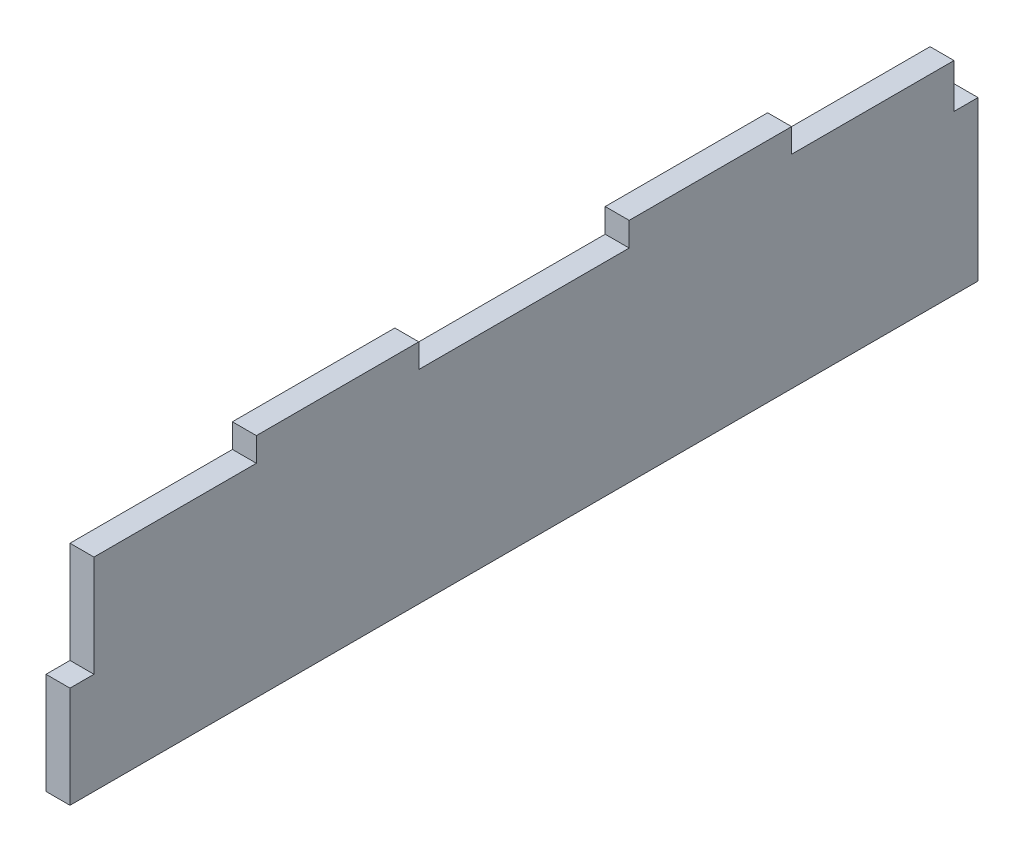
ISO-10303-21;
HEADER;
FILE_DESCRIPTION(('STEP AP214'),'2;1');
FILE_NAME('part.step','',(''),(''),'','','');
FILE_SCHEMA(('AUTOMOTIVE_DESIGN { 1 0 10303 214 1 1 1 1 }'));
ENDSEC;
DATA;
#1=APPLICATION_CONTEXT('core data for automotive mechanical design processes');
#2=APPLICATION_PROTOCOL_DEFINITION('international standard','automotive_design',2000,#1);
#3=PRODUCT_CONTEXT('',#1,'mechanical');
#4=PRODUCT('Part','Part','',(#3));
#5=PRODUCT_RELATED_PRODUCT_CATEGORY('part','',(#4));
#6=PRODUCT_DEFINITION_FORMATION('','',#4);
#7=PRODUCT_DEFINITION_CONTEXT('part definition',#1,'design');
#8=PRODUCT_DEFINITION('design','',#6,#7);
#9=PRODUCT_DEFINITION_SHAPE('','',#8);
#10=(LENGTH_UNIT() NAMED_UNIT(*) SI_UNIT(.MILLI.,.METRE.));
#11=(NAMED_UNIT(*) PLANE_ANGLE_UNIT() SI_UNIT($,.RADIAN.));
#12=(NAMED_UNIT(*) SI_UNIT($,.STERADIAN.) SOLID_ANGLE_UNIT());
#13=UNCERTAINTY_MEASURE_WITH_UNIT(LENGTH_MEASURE(1.E-05),#10,'distance_accuracy_value','');
#14=(GEOMETRIC_REPRESENTATION_CONTEXT(3) GLOBAL_UNCERTAINTY_ASSIGNED_CONTEXT((#13)) GLOBAL_UNIT_ASSIGNED_CONTEXT((#10,
#11,#12)) REPRESENTATION_CONTEXT('',''));
#15=CARTESIAN_POINT('',(0.,0.,0.));
#16=DIRECTION('',(0.,0.,1.));
#17=DIRECTION('',(1.,0.,0.));
#18=AXIS2_PLACEMENT_3D('',#15,#16,#17);
#19=CARTESIAN_POINT('',(3.,0.,-113.6));
#20=DIRECTION('',(0.,1.,0.));
#21=DIRECTION('',(0.,0.,1.));
#22=AXIS2_PLACEMENT_3D('',#19,#20,#21);
#23=PLANE('',#22);
#24=DIRECTION('',(0.,0.,-1.));
#25=VECTOR('',#24,1.);
#26=CARTESIAN_POINT('',(0.,0.,-113.6));
#27=LINE('',#26,#25);
#28=CARTESIAN_POINT('',(0.,0.,0.));
#29=VERTEX_POINT('',#28);
#30=CARTESIAN_POINT('',(0.,0.,-113.6));
#31=VERTEX_POINT('',#30);
#32=EDGE_CURVE('E177',#29,#31,#27,.T.);
#33=ORIENTED_EDGE('',*,*,#32,.T.);
#34=DIRECTION('',(-1.,0.,0.));
#35=VECTOR('',#34,1.);
#36=CARTESIAN_POINT('',(3.,0.,-113.6));
#37=LINE('',#36,#35);
#38=CARTESIAN_POINT('',(3.,0.,-113.6));
#39=VERTEX_POINT('',#38);
#40=EDGE_CURVE('E11',#39,#31,#37,.T.);
#41=ORIENTED_EDGE('',*,*,#40,.F.);
#42=DIRECTION('',(0.,0.,-1.));
#43=VECTOR('',#42,1.);
#44=CARTESIAN_POINT('',(3.,0.,-113.6));
#45=LINE('',#44,#43);
#46=CARTESIAN_POINT('',(3.,0.,0.));
#47=VERTEX_POINT('',#46);
#48=EDGE_CURVE('E207',#47,#39,#45,.T.);
#49=ORIENTED_EDGE('',*,*,#48,.F.);
#50=DIRECTION('',(-1.,0.,0.));
#51=VECTOR('',#50,1.);
#52=CARTESIAN_POINT('',(3.,0.,0.));
#53=LINE('',#52,#51);
#54=EDGE_CURVE('E173',#47,#29,#53,.T.);
#55=ORIENTED_EDGE('',*,*,#54,.T.);
#56=EDGE_LOOP('',(#33,#41,#49,#55));
#57=FACE_BOUND('',#56,.T.);
#58=ADVANCED_FACE('F33',(#57),#23,.F.);
#59=CARTESIAN_POINT('',(3.,19.8867256637168,-113.6));
#60=DIRECTION('',(0.,0.,1.));
#61=DIRECTION('',(1.,0.,0.));
#62=AXIS2_PLACEMENT_3D('',#59,#60,#61);
#63=PLANE('',#62);
#64=DIRECTION('',(0.,1.,0.));
#65=VECTOR('',#64,1.);
#66=CARTESIAN_POINT('',(0.,19.8867256637168,-113.6));
#67=LINE('',#66,#65);
#68=CARTESIAN_POINT('',(0.,19.8867256637168,-113.6));
#69=VERTEX_POINT('',#68);
#70=EDGE_CURVE('E180',#31,#69,#67,.T.);
#71=ORIENTED_EDGE('',*,*,#70,.T.);
#72=DIRECTION('',(-1.,0.,0.));
#73=VECTOR('',#72,1.);
#74=CARTESIAN_POINT('',(3.,19.8867256637168,-113.6));
#75=LINE('',#74,#73);
#76=CARTESIAN_POINT('',(3.,19.8867256637168,-113.6));
#77=VERTEX_POINT('',#76);
#78=EDGE_CURVE('E41',#77,#69,#75,.T.);
#79=ORIENTED_EDGE('',*,*,#78,.F.);
#80=DIRECTION('',(0.,1.,0.));
#81=VECTOR('',#80,1.);
#82=CARTESIAN_POINT('',(3.,19.8867256637168,-113.6));
#83=LINE('',#82,#81);
#84=EDGE_CURVE('E116',#39,#77,#83,.T.);
#85=ORIENTED_EDGE('',*,*,#84,.F.);
#86=ORIENTED_EDGE('',*,*,#40,.T.);
#87=EDGE_LOOP('',(#71,#79,#85,#86));
#88=FACE_BOUND('',#87,.T.);
#89=ADVANCED_FACE('F305',(#88),#63,.F.);
#90=CARTESIAN_POINT('',(3.,19.8867256637168,-110.6));
#91=DIRECTION('',(0.,-1.,0.));
#92=DIRECTION('',(0.,0.,-1.));
#93=AXIS2_PLACEMENT_3D('',#90,#91,#92);
#94=PLANE('',#93);
#95=DIRECTION('',(0.,0.,1.));
#96=VECTOR('',#95,1.);
#97=CARTESIAN_POINT('',(0.,19.8867256637168,-110.6));
#98=LINE('',#97,#96);
#99=CARTESIAN_POINT('',(0.,19.8867256637168,-110.6));
#100=VERTEX_POINT('',#99);
#101=EDGE_CURVE('E182',#69,#100,#98,.T.);
#102=ORIENTED_EDGE('',*,*,#101,.T.);
#103=DIRECTION('',(-1.,0.,0.));
#104=VECTOR('',#103,1.);
#105=CARTESIAN_POINT('',(3.,19.8867256637168,-110.6));
#106=LINE('',#105,#104);
#107=CARTESIAN_POINT('',(3.,19.8867256637168,-110.6));
#108=VERTEX_POINT('',#107);
#109=EDGE_CURVE('E238',#108,#100,#106,.T.);
#110=ORIENTED_EDGE('',*,*,#109,.F.);
#111=DIRECTION('',(0.,0.,1.));
#112=VECTOR('',#111,1.);
#113=CARTESIAN_POINT('',(3.,19.8867256637168,-110.6));
#114=LINE('',#113,#112);
#115=EDGE_CURVE('E246',#77,#108,#114,.T.);
#116=ORIENTED_EDGE('',*,*,#115,.F.);
#117=ORIENTED_EDGE('',*,*,#78,.T.);
#118=EDGE_LOOP('',(#102,#110,#116,#117));
#119=FACE_BOUND('',#118,.T.);
#120=ADVANCED_FACE('F244',(#119),#94,.F.);
#121=CARTESIAN_POINT('',(3.,25.4,-110.6));
#122=DIRECTION('',(0.,0.,1.));
#123=DIRECTION('',(1.,0.,0.));
#124=AXIS2_PLACEMENT_3D('',#121,#122,#123);
#125=PLANE('',#124);
#126=DIRECTION('',(0.,1.,0.));
#127=VECTOR('',#126,1.);
#128=CARTESIAN_POINT('',(0.,25.4,-110.6));
#129=LINE('',#128,#127);
#130=CARTESIAN_POINT('',(0.,25.4,-110.6));
#131=VERTEX_POINT('',#130);
#132=EDGE_CURVE('E184',#100,#131,#129,.T.);
#133=ORIENTED_EDGE('',*,*,#132,.T.);
#134=DIRECTION('',(-1.,0.,0.));
#135=VECTOR('',#134,1.);
#136=CARTESIAN_POINT('',(3.,25.4,-110.6));
#137=LINE('',#136,#135);
#138=CARTESIAN_POINT('',(3.,25.4,-110.6));
#139=VERTEX_POINT('',#138);
#140=EDGE_CURVE('E235',#139,#131,#137,.T.);
#141=ORIENTED_EDGE('',*,*,#140,.F.);
#142=DIRECTION('',(0.,1.,0.));
#143=VECTOR('',#142,1.);
#144=CARTESIAN_POINT('',(3.,25.4,-110.6));
#145=LINE('',#144,#143);
#146=EDGE_CURVE('E264',#108,#139,#145,.T.);
#147=ORIENTED_EDGE('',*,*,#146,.F.);
#148=ORIENTED_EDGE('',*,*,#109,.T.);
#149=EDGE_LOOP('',(#133,#141,#147,#148));
#150=FACE_BOUND('',#149,.T.);
#151=ADVANCED_FACE('F255',(#150),#125,.F.);
#152=CARTESIAN_POINT('',(3.,25.4,-90.28));
#153=DIRECTION('',(0.,-1.,0.));
#154=DIRECTION('',(0.,0.,-1.));
#155=AXIS2_PLACEMENT_3D('',#152,#153,#154);
#156=PLANE('',#155);
#157=DIRECTION('',(0.,0.,1.));
#158=VECTOR('',#157,1.);
#159=CARTESIAN_POINT('',(0.,25.4,-90.28));
#160=LINE('',#159,#158);
#161=CARTESIAN_POINT('',(0.,25.4,-90.28));
#162=VERTEX_POINT('',#161);
#163=EDGE_CURVE('E186',#131,#162,#160,.T.);
#164=ORIENTED_EDGE('',*,*,#163,.T.);
#165=DIRECTION('',(-1.,0.,0.));
#166=VECTOR('',#165,1.);
#167=CARTESIAN_POINT('',(3.,25.4,-90.28));
#168=LINE('',#167,#166);
#169=CARTESIAN_POINT('',(3.,25.4,-90.28));
#170=VERTEX_POINT('',#169);
#171=EDGE_CURVE('E232',#170,#162,#168,.T.);
#172=ORIENTED_EDGE('',*,*,#171,.F.);
#173=DIRECTION('',(0.,0.,1.));
#174=VECTOR('',#173,1.);
#175=CARTESIAN_POINT('',(3.,25.4,-90.28));
#176=LINE('',#175,#174);
#177=EDGE_CURVE('E261',#139,#170,#176,.T.);
#178=ORIENTED_EDGE('',*,*,#177,.F.);
#179=ORIENTED_EDGE('',*,*,#140,.T.);
#180=EDGE_LOOP('',(#164,#172,#178,#179));
#181=FACE_BOUND('',#180,.T.);
#182=ADVANCED_FACE('F259',(#181),#156,.F.);
#183=CARTESIAN_POINT('',(3.,28.4,-90.28));
#184=DIRECTION('',(0.,0.,1.));
#185=DIRECTION('',(1.,0.,0.));
#186=AXIS2_PLACEMENT_3D('',#183,#184,#185);
#187=PLANE('',#186);
#188=DIRECTION('',(0.,1.,0.));
#189=VECTOR('',#188,1.);
#190=CARTESIAN_POINT('',(0.,28.4,-90.28));
#191=LINE('',#190,#189);
#192=CARTESIAN_POINT('',(0.,28.4,-90.28));
#193=VERTEX_POINT('',#192);
#194=EDGE_CURVE('E188',#162,#193,#191,.T.);
#195=ORIENTED_EDGE('',*,*,#194,.T.);
#196=DIRECTION('',(-1.,0.,0.));
#197=VECTOR('',#196,1.);
#198=CARTESIAN_POINT('',(3.,28.4,-90.28));
#199=LINE('',#198,#197);
#200=CARTESIAN_POINT('',(3.,28.4,-90.28));
#201=VERTEX_POINT('',#200);
#202=EDGE_CURVE('E229',#201,#193,#199,.T.);
#203=ORIENTED_EDGE('',*,*,#202,.F.);
#204=DIRECTION('',(0.,1.,0.));
#205=VECTOR('',#204,1.);
#206=CARTESIAN_POINT('',(3.,28.4,-90.28));
#207=LINE('',#206,#205);
#208=EDGE_CURVE('E263',#170,#201,#207,.T.);
#209=ORIENTED_EDGE('',*,*,#208,.F.);
#210=ORIENTED_EDGE('',*,*,#171,.T.);
#211=EDGE_LOOP('',(#195,#203,#209,#210));
#212=FACE_BOUND('',#211,.T.);
#213=ADVANCED_FACE('F318',(#212),#187,.F.);
#214=CARTESIAN_POINT('',(3.,28.4,-69.96));
#215=DIRECTION('',(0.,-1.,0.));
#216=DIRECTION('',(0.,0.,-1.));
#217=AXIS2_PLACEMENT_3D('',#214,#215,#216);
#218=PLANE('',#217);
#219=DIRECTION('',(0.,0.,1.));
#220=VECTOR('',#219,1.);
#221=CARTESIAN_POINT('',(0.,28.4,-69.96));
#222=LINE('',#221,#220);
#223=CARTESIAN_POINT('',(0.,28.4,-69.96));
#224=VERTEX_POINT('',#223);
#225=EDGE_CURVE('E190',#193,#224,#222,.T.);
#226=ORIENTED_EDGE('',*,*,#225,.T.);
#227=DIRECTION('',(-1.,0.,0.));
#228=VECTOR('',#227,1.);
#229=CARTESIAN_POINT('',(3.,28.4,-69.96));
#230=LINE('',#229,#228);
#231=CARTESIAN_POINT('',(3.,28.4,-69.96));
#232=VERTEX_POINT('',#231);
#233=EDGE_CURVE('E226',#232,#224,#230,.T.);
#234=ORIENTED_EDGE('',*,*,#233,.F.);
#235=DIRECTION('',(0.,0.,1.));
#236=VECTOR('',#235,1.);
#237=CARTESIAN_POINT('',(3.,28.4,-69.96));
#238=LINE('',#237,#236);
#239=EDGE_CURVE('E266',#201,#232,#238,.T.);
#240=ORIENTED_EDGE('',*,*,#239,.F.);
#241=ORIENTED_EDGE('',*,*,#202,.T.);
#242=EDGE_LOOP('',(#226,#234,#240,#241));
#243=FACE_BOUND('',#242,.T.);
#244=ADVANCED_FACE('F321',(#243),#218,.F.);
#245=CARTESIAN_POINT('',(3.,25.4,-69.96));
#246=DIRECTION('',(0.,0.,-1.));
#247=DIRECTION('',(-1.,0.,0.));
#248=AXIS2_PLACEMENT_3D('',#245,#246,#247);
#249=PLANE('',#248);
#250=DIRECTION('',(0.,-1.,0.));
#251=VECTOR('',#250,1.);
#252=CARTESIAN_POINT('',(0.,25.4,-69.96));
#253=LINE('',#252,#251);
#254=CARTESIAN_POINT('',(0.,25.4,-69.96));
#255=VERTEX_POINT('',#254);
#256=EDGE_CURVE('E192',#224,#255,#253,.T.);
#257=ORIENTED_EDGE('',*,*,#256,.T.);
#258=DIRECTION('',(-1.,0.,0.));
#259=VECTOR('',#258,1.);
#260=CARTESIAN_POINT('',(3.,25.4,-69.96));
#261=LINE('',#260,#259);
#262=CARTESIAN_POINT('',(3.,25.4,-69.96));
#263=VERTEX_POINT('',#262);
#264=EDGE_CURVE('E223',#263,#255,#261,.T.);
#265=ORIENTED_EDGE('',*,*,#264,.F.);
#266=DIRECTION('',(0.,-1.,0.));
#267=VECTOR('',#266,1.);
#268=CARTESIAN_POINT('',(3.,25.4,-69.96));
#269=LINE('',#268,#267);
#270=EDGE_CURVE('E272',#232,#263,#269,.T.);
#271=ORIENTED_EDGE('',*,*,#270,.F.);
#272=ORIENTED_EDGE('',*,*,#233,.T.);
#273=EDGE_LOOP('',(#257,#265,#271,#272));
#274=FACE_BOUND('',#273,.T.);
#275=ADVANCED_FACE('F325',(#274),#249,.F.);
#276=CARTESIAN_POINT('',(3.,25.4,-43.64));
#277=DIRECTION('',(0.,-1.,0.));
#278=DIRECTION('',(0.,0.,-1.));
#279=AXIS2_PLACEMENT_3D('',#276,#277,#278);
#280=PLANE('',#279);
#281=DIRECTION('',(0.,0.,1.));
#282=VECTOR('',#281,1.);
#283=CARTESIAN_POINT('',(0.,25.4,-43.64));
#284=LINE('',#283,#282);
#285=CARTESIAN_POINT('',(0.,25.4,-43.64));
#286=VERTEX_POINT('',#285);
#287=EDGE_CURVE('E194',#255,#286,#284,.T.);
#288=ORIENTED_EDGE('',*,*,#287,.T.);
#289=DIRECTION('',(-1.,0.,0.));
#290=VECTOR('',#289,1.);
#291=CARTESIAN_POINT('',(3.,25.4,-43.64));
#292=LINE('',#291,#290);
#293=CARTESIAN_POINT('',(3.,25.4,-43.64));
#294=VERTEX_POINT('',#293);
#295=EDGE_CURVE('E220',#294,#286,#292,.T.);
#296=ORIENTED_EDGE('',*,*,#295,.F.);
#297=DIRECTION('',(0.,0.,1.));
#298=VECTOR('',#297,1.);
#299=CARTESIAN_POINT('',(3.,25.4,-43.64));
#300=LINE('',#299,#298);
#301=EDGE_CURVE('E274',#263,#294,#300,.T.);
#302=ORIENTED_EDGE('',*,*,#301,.F.);
#303=ORIENTED_EDGE('',*,*,#264,.T.);
#304=EDGE_LOOP('',(#288,#296,#302,#303));
#305=FACE_BOUND('',#304,.T.);
#306=ADVANCED_FACE('F329',(#305),#280,.F.);
#307=CARTESIAN_POINT('',(3.,28.4,-43.64));
#308=DIRECTION('',(0.,0.,1.));
#309=DIRECTION('',(0.,-1.,0.));
#310=AXIS2_PLACEMENT_3D('',#307,#308,#309);
#311=PLANE('',#310);
#312=DIRECTION('',(0.,1.,0.));
#313=VECTOR('',#312,1.);
#314=CARTESIAN_POINT('',(0.,28.4,-43.64));
#315=LINE('',#314,#313);
#316=CARTESIAN_POINT('',(0.,28.4,-43.64));
#317=VERTEX_POINT('',#316);
#318=EDGE_CURVE('E196',#286,#317,#315,.T.);
#319=ORIENTED_EDGE('',*,*,#318,.T.);
#320=DIRECTION('',(-1.,0.,0.));
#321=VECTOR('',#320,1.);
#322=CARTESIAN_POINT('',(3.,28.4,-43.64));
#323=LINE('',#322,#321);
#324=CARTESIAN_POINT('',(3.,28.4,-43.64));
#325=VERTEX_POINT('',#324);
#326=EDGE_CURVE('E217',#325,#317,#323,.T.);
#327=ORIENTED_EDGE('',*,*,#326,.F.);
#328=DIRECTION('',(0.,1.,0.));
#329=VECTOR('',#328,1.);
#330=CARTESIAN_POINT('',(3.,28.4,-43.64));
#331=LINE('',#330,#329);
#332=EDGE_CURVE('E276',#294,#325,#331,.T.);
#333=ORIENTED_EDGE('',*,*,#332,.F.);
#334=ORIENTED_EDGE('',*,*,#295,.T.);
#335=EDGE_LOOP('',(#319,#327,#333,#334));
#336=FACE_BOUND('',#335,.T.);
#337=ADVANCED_FACE('F333',(#336),#311,.F.);
#338=CARTESIAN_POINT('',(3.,28.4,-23.32));
#339=DIRECTION('',(0.,-1.,0.));
#340=DIRECTION('',(0.,0.,-1.));
#341=AXIS2_PLACEMENT_3D('',#338,#339,#340);
#342=PLANE('',#341);
#343=DIRECTION('',(0.,0.,1.));
#344=VECTOR('',#343,1.);
#345=CARTESIAN_POINT('',(0.,28.4,-23.32));
#346=LINE('',#345,#344);
#347=CARTESIAN_POINT('',(0.,28.4,-23.32));
#348=VERTEX_POINT('',#347);
#349=EDGE_CURVE('E198',#317,#348,#346,.T.);
#350=ORIENTED_EDGE('',*,*,#349,.T.);
#351=DIRECTION('',(-1.,0.,0.));
#352=VECTOR('',#351,1.);
#353=CARTESIAN_POINT('',(3.,28.4,-23.32));
#354=LINE('',#353,#352);
#355=CARTESIAN_POINT('',(3.,28.4,-23.32));
#356=VERTEX_POINT('',#355);
#357=EDGE_CURVE('E214',#356,#348,#354,.T.);
#358=ORIENTED_EDGE('',*,*,#357,.F.);
#359=DIRECTION('',(0.,0.,1.));
#360=VECTOR('',#359,1.);
#361=CARTESIAN_POINT('',(3.,28.4,-23.32));
#362=LINE('',#361,#360);
#363=EDGE_CURVE('E278',#325,#356,#362,.T.);
#364=ORIENTED_EDGE('',*,*,#363,.F.);
#365=ORIENTED_EDGE('',*,*,#326,.T.);
#366=EDGE_LOOP('',(#350,#358,#364,#365));
#367=FACE_BOUND('',#366,.T.);
#368=ADVANCED_FACE('F337',(#367),#342,.F.);
#369=CARTESIAN_POINT('',(3.,25.4,-23.32));
#370=DIRECTION('',(0.,0.,-1.));
#371=DIRECTION('',(-1.,0.,0.));
#372=AXIS2_PLACEMENT_3D('',#369,#370,#371);
#373=PLANE('',#372);
#374=DIRECTION('',(0.,-1.,0.));
#375=VECTOR('',#374,1.);
#376=CARTESIAN_POINT('',(0.,25.4,-23.32));
#377=LINE('',#376,#375);
#378=CARTESIAN_POINT('',(0.,25.4,-23.32));
#379=VERTEX_POINT('',#378);
#380=EDGE_CURVE('E200',#348,#379,#377,.T.);
#381=ORIENTED_EDGE('',*,*,#380,.T.);
#382=DIRECTION('',(-1.,0.,0.));
#383=VECTOR('',#382,1.);
#384=CARTESIAN_POINT('',(3.,25.4,-23.32));
#385=LINE('',#384,#383);
#386=CARTESIAN_POINT('',(3.,25.4,-23.32));
#387=VERTEX_POINT('',#386);
#388=EDGE_CURVE('E211',#387,#379,#385,.T.);
#389=ORIENTED_EDGE('',*,*,#388,.F.);
#390=DIRECTION('',(0.,-1.,0.));
#391=VECTOR('',#390,1.);
#392=CARTESIAN_POINT('',(3.,25.4,-23.32));
#393=LINE('',#392,#391);
#394=EDGE_CURVE('E280',#356,#387,#393,.T.);
#395=ORIENTED_EDGE('',*,*,#394,.F.);
#396=ORIENTED_EDGE('',*,*,#357,.T.);
#397=EDGE_LOOP('',(#381,#389,#395,#396));
#398=FACE_BOUND('',#397,.T.);
#399=ADVANCED_FACE('F286',(#398),#373,.F.);
#400=CARTESIAN_POINT('',(3.,25.4,-2.99999999999999));
#401=DIRECTION('',(0.,-1.,0.));
#402=DIRECTION('',(0.,0.,-1.));
#403=AXIS2_PLACEMENT_3D('',#400,#401,#402);
#404=PLANE('',#403);
#405=DIRECTION('',(0.,0.,1.));
#406=VECTOR('',#405,1.);
#407=CARTESIAN_POINT('',(0.,25.4,-2.99999999999999));
#408=LINE('',#407,#406);
#409=CARTESIAN_POINT('',(0.,25.4,-2.99999999999999));
#410=VERTEX_POINT('',#409);
#411=EDGE_CURVE('E202',#379,#410,#408,.T.);
#412=ORIENTED_EDGE('',*,*,#411,.T.);
#413=DIRECTION('',(-1.,0.,0.));
#414=VECTOR('',#413,1.);
#415=CARTESIAN_POINT('',(3.,25.4,-2.99999999999999));
#416=LINE('',#415,#414);
#417=CARTESIAN_POINT('',(3.,25.4,-2.99999999999999));
#418=VERTEX_POINT('',#417);
#419=EDGE_CURVE('E168',#418,#410,#416,.T.);
#420=ORIENTED_EDGE('',*,*,#419,.F.);
#421=DIRECTION('',(0.,0.,1.));
#422=VECTOR('',#421,1.);
#423=CARTESIAN_POINT('',(3.,25.4,-2.99999999999999));
#424=LINE('',#423,#422);
#425=EDGE_CURVE('E159',#387,#418,#424,.T.);
#426=ORIENTED_EDGE('',*,*,#425,.F.);
#427=ORIENTED_EDGE('',*,*,#388,.T.);
#428=EDGE_LOOP('',(#412,#420,#426,#427));
#429=FACE_BOUND('',#428,.T.);
#430=ADVANCED_FACE('F290',(#429),#404,.F.);
#431=CARTESIAN_POINT('',(3.,12.7,-2.99999999999997));
#432=DIRECTION('',(0.,0.,-1.));
#433=DIRECTION('',(0.,1.,0.));
#434=AXIS2_PLACEMENT_3D('',#431,#432,#433);
#435=PLANE('',#434);
#436=DIRECTION('',(0.,-1.,0.));
#437=VECTOR('',#436,1.);
#438=CARTESIAN_POINT('',(0.,12.7,-2.99999999999997));
#439=LINE('',#438,#437);
#440=CARTESIAN_POINT('',(0.,12.7,-2.99999999999997));
#441=VERTEX_POINT('',#440);
#442=EDGE_CURVE('E167',#410,#441,#439,.T.);
#443=ORIENTED_EDGE('',*,*,#442,.T.);
#444=DIRECTION('',(-1.,0.,0.));
#445=VECTOR('',#444,1.);
#446=CARTESIAN_POINT('',(3.,12.7,-2.99999999999997));
#447=LINE('',#446,#445);
#448=CARTESIAN_POINT('',(3.,12.7,-2.99999999999997));
#449=VERTEX_POINT('',#448);
#450=EDGE_CURVE('E164',#449,#441,#447,.T.);
#451=ORIENTED_EDGE('',*,*,#450,.F.);
#452=DIRECTION('',(0.,-1.,0.));
#453=VECTOR('',#452,1.);
#454=CARTESIAN_POINT('',(3.,12.7,-2.99999999999997));
#455=LINE('',#454,#453);
#456=EDGE_CURVE('E153',#418,#449,#455,.T.);
#457=ORIENTED_EDGE('',*,*,#456,.F.);
#458=ORIENTED_EDGE('',*,*,#419,.T.);
#459=EDGE_LOOP('',(#443,#451,#457,#458));
#460=FACE_BOUND('',#459,.T.);
#461=ADVANCED_FACE('F165',(#460),#435,.F.);
#462=CARTESIAN_POINT('',(3.,12.7,0.));
#463=DIRECTION('',(0.,-1.,0.));
#464=DIRECTION('',(0.,0.,-1.));
#465=AXIS2_PLACEMENT_3D('',#462,#463,#464);
#466=PLANE('',#465);
#467=DIRECTION('',(0.,0.,1.));
#468=VECTOR('',#467,1.);
#469=CARTESIAN_POINT('',(0.,12.7,0.));
#470=LINE('',#469,#468);
#471=CARTESIAN_POINT('',(0.,12.7,0.));
#472=VERTEX_POINT('',#471);
#473=EDGE_CURVE('E102',#441,#472,#470,.T.);
#474=ORIENTED_EDGE('',*,*,#473,.T.);
#475=DIRECTION('',(-1.,0.,0.));
#476=VECTOR('',#475,1.);
#477=CARTESIAN_POINT('',(3.,12.7,0.));
#478=LINE('',#477,#476);
#479=CARTESIAN_POINT('',(3.,12.7,0.));
#480=VERTEX_POINT('',#479);
#481=EDGE_CURVE('E169',#480,#472,#478,.T.);
#482=ORIENTED_EDGE('',*,*,#481,.F.);
#483=DIRECTION('',(0.,0.,1.));
#484=VECTOR('',#483,1.);
#485=CARTESIAN_POINT('',(3.,12.7,0.));
#486=LINE('',#485,#484);
#487=EDGE_CURVE('E157',#449,#480,#486,.T.);
#488=ORIENTED_EDGE('',*,*,#487,.F.);
#489=ORIENTED_EDGE('',*,*,#450,.T.);
#490=EDGE_LOOP('',(#474,#482,#488,#489));
#491=FACE_BOUND('',#490,.T.);
#492=ADVANCED_FACE('F171',(#491),#466,.F.);
#493=CARTESIAN_POINT('',(3.,0.,0.));
#494=DIRECTION('',(0.,0.,-1.));
#495=DIRECTION('',(-1.,0.,0.));
#496=AXIS2_PLACEMENT_3D('',#493,#494,#495);
#497=PLANE('',#496);
#498=DIRECTION('',(0.,-1.,0.));
#499=VECTOR('',#498,1.);
#500=CARTESIAN_POINT('',(0.,0.,0.));
#501=LINE('',#500,#499);
#502=EDGE_CURVE('E108',#472,#29,#501,.T.);
#503=ORIENTED_EDGE('',*,*,#502,.T.);
#504=ORIENTED_EDGE('',*,*,#54,.F.);
#505=DIRECTION('',(0.,-1.,0.));
#506=VECTOR('',#505,1.);
#507=CARTESIAN_POINT('',(3.,0.,0.));
#508=LINE('',#507,#506);
#509=EDGE_CURVE('E49',#480,#47,#508,.T.);
#510=ORIENTED_EDGE('',*,*,#509,.F.);
#511=ORIENTED_EDGE('',*,*,#481,.T.);
#512=EDGE_LOOP('',(#503,#504,#510,#511));
#513=FACE_BOUND('',#512,.T.);
#514=ADVANCED_FACE('F294',(#513),#497,.F.);
#515=CARTESIAN_POINT('',(3.,0.,0.));
#516=DIRECTION('',(-1.,0.,0.));
#517=DIRECTION('',(0.,0.,1.));
#518=AXIS2_PLACEMENT_3D('',#515,#516,#517);
#519=PLANE('',#518);
#520=ORIENTED_EDGE('',*,*,#48,.T.);
#521=ORIENTED_EDGE('',*,*,#84,.T.);
#522=ORIENTED_EDGE('',*,*,#115,.T.);
#523=ORIENTED_EDGE('',*,*,#146,.T.);
#524=ORIENTED_EDGE('',*,*,#177,.T.);
#525=ORIENTED_EDGE('',*,*,#208,.T.);
#526=ORIENTED_EDGE('',*,*,#239,.T.);
#527=ORIENTED_EDGE('',*,*,#270,.T.);
#528=ORIENTED_EDGE('',*,*,#301,.T.);
#529=ORIENTED_EDGE('',*,*,#332,.T.);
#530=ORIENTED_EDGE('',*,*,#363,.T.);
#531=ORIENTED_EDGE('',*,*,#394,.T.);
#532=ORIENTED_EDGE('',*,*,#425,.T.);
#533=ORIENTED_EDGE('',*,*,#456,.T.);
#534=ORIENTED_EDGE('',*,*,#487,.T.);
#535=ORIENTED_EDGE('',*,*,#509,.T.);
#536=EDGE_LOOP('',(#520,#521,#522,#523,#524,#525,#526,#527,#528,#529,#530,#531,#532,#533,#534,#535));
#537=FACE_BOUND('',#536,.T.);
#538=ADVANCED_FACE('F155',(#537),#519,.F.);
#539=CARTESIAN_POINT('',(0.,0.,0.));
#540=DIRECTION('',(-1.,0.,0.));
#541=DIRECTION('',(0.,0.,1.));
#542=AXIS2_PLACEMENT_3D('',#539,#540,#541);
#543=PLANE('',#542);
#544=ORIENTED_EDGE('',*,*,#32,.F.);
#545=ORIENTED_EDGE('',*,*,#502,.F.);
#546=ORIENTED_EDGE('',*,*,#473,.F.);
#547=ORIENTED_EDGE('',*,*,#442,.F.);
#548=ORIENTED_EDGE('',*,*,#411,.F.);
#549=ORIENTED_EDGE('',*,*,#380,.F.);
#550=ORIENTED_EDGE('',*,*,#349,.F.);
#551=ORIENTED_EDGE('',*,*,#318,.F.);
#552=ORIENTED_EDGE('',*,*,#287,.F.);
#553=ORIENTED_EDGE('',*,*,#256,.F.);
#554=ORIENTED_EDGE('',*,*,#225,.F.);
#555=ORIENTED_EDGE('',*,*,#194,.F.);
#556=ORIENTED_EDGE('',*,*,#163,.F.);
#557=ORIENTED_EDGE('',*,*,#132,.F.);
#558=ORIENTED_EDGE('',*,*,#101,.F.);
#559=ORIENTED_EDGE('',*,*,#70,.F.);
#560=EDGE_LOOP('',(#544,#545,#546,#547,#548,#549,#550,#551,#552,#553,#554,#555,#556,#557,#558,#559));
#561=FACE_BOUND('',#560,.T.);
#562=ADVANCED_FACE('F250',(#561),#543,.T.);
#563=CLOSED_SHELL('',(#58,#89,#120,#151,#182,#213,#244,#275,#306,#337,#368,#399,#430,#461,#492,
#514,#538,#562));
#564=MANIFOLD_SOLID_BREP('B2',#563);
#565=ADVANCED_BREP_SHAPE_REPRESENTATION('',(#18,#564),#14);
#566=SHAPE_DEFINITION_REPRESENTATION(#9,#565);
ENDSEC;
END-ISO-10303-21;
